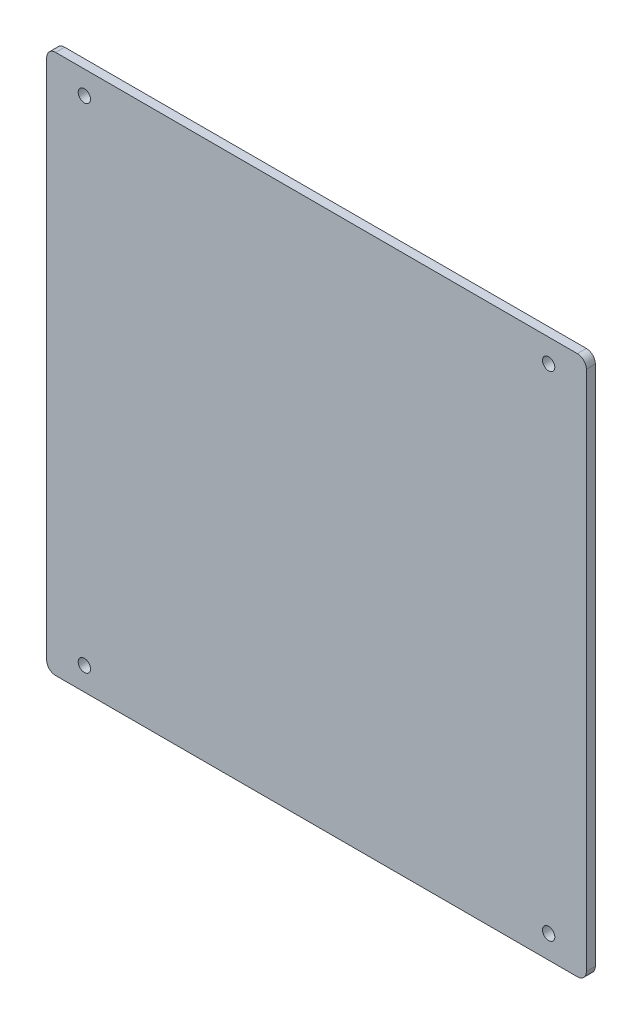
ISO-10303-21;
HEADER;
FILE_DESCRIPTION(('STEP AP214'),'2;1');
FILE_NAME('part.step','',(''),(''),'','','');
FILE_SCHEMA(('AUTOMOTIVE_DESIGN { 1 0 10303 214 1 1 1 1 }'));
ENDSEC;
DATA;
#1=APPLICATION_CONTEXT('core data for automotive mechanical design processes');
#2=APPLICATION_PROTOCOL_DEFINITION('international standard','automotive_design',2000,#1);
#3=PRODUCT_CONTEXT('',#1,'mechanical');
#4=PRODUCT('Part','Part','',(#3));
#5=PRODUCT_RELATED_PRODUCT_CATEGORY('part','',(#4));
#6=PRODUCT_DEFINITION_FORMATION('','',#4);
#7=PRODUCT_DEFINITION_CONTEXT('part definition',#1,'design');
#8=PRODUCT_DEFINITION('design','',#6,#7);
#9=PRODUCT_DEFINITION_SHAPE('','',#8);
#10=(LENGTH_UNIT() NAMED_UNIT(*) SI_UNIT(.MILLI.,.METRE.));
#11=(NAMED_UNIT(*) PLANE_ANGLE_UNIT() SI_UNIT($,.RADIAN.));
#12=(NAMED_UNIT(*) SI_UNIT($,.STERADIAN.) SOLID_ANGLE_UNIT());
#13=UNCERTAINTY_MEASURE_WITH_UNIT(LENGTH_MEASURE(1.E-05),#10,'distance_accuracy_value','');
#14=(GEOMETRIC_REPRESENTATION_CONTEXT(3) GLOBAL_UNCERTAINTY_ASSIGNED_CONTEXT((#13)) GLOBAL_UNIT_ASSIGNED_CONTEXT((#10,
#11,#12)) REPRESENTATION_CONTEXT('',''));
#15=CARTESIAN_POINT('',(0.,0.,0.));
#16=DIRECTION('',(0.,0.,1.));
#17=DIRECTION('',(1.,0.,0.));
#18=AXIS2_PLACEMENT_3D('',#15,#16,#17);
#19=CARTESIAN_POINT('',(90.,-90.,3.));
#20=DIRECTION('',(-1.,0.,0.));
#21=DIRECTION('',(0.,0.,1.));
#22=AXIS2_PLACEMENT_3D('',#19,#20,#21);
#23=PLANE('',#22);
#24=DIRECTION('',(0.,1.,0.));
#25=VECTOR('',#24,1.);
#26=CARTESIAN_POINT('',(90.,-90.,3.));
#27=LINE('',#26,#25);
#28=CARTESIAN_POINT('',(90.,-87.,3.));
#29=VERTEX_POINT('',#28);
#30=CARTESIAN_POINT('',(90.,86.9999999999999,3.));
#31=VERTEX_POINT('',#30);
#32=EDGE_CURVE('E121',#29,#31,#27,.T.);
#33=ORIENTED_EDGE('',*,*,#32,.F.);
#34=DIRECTION('',(0.,0.,-1.));
#35=VECTOR('',#34,1.);
#36=CARTESIAN_POINT('',(90.,-87.,3.));
#37=LINE('',#36,#35);
#38=CARTESIAN_POINT('',(90.,-87.,0.));
#39=VERTEX_POINT('',#38);
#40=EDGE_CURVE('E106',#29,#39,#37,.T.);
#41=ORIENTED_EDGE('',*,*,#40,.T.);
#42=DIRECTION('',(0.,1.,0.));
#43=VECTOR('',#42,1.);
#44=CARTESIAN_POINT('',(90.,-90.,0.));
#45=LINE('',#44,#43);
#46=CARTESIAN_POINT('',(90.,86.9999999999999,0.));
#47=VERTEX_POINT('',#46);
#48=EDGE_CURVE('E118',#39,#47,#45,.T.);
#49=ORIENTED_EDGE('',*,*,#48,.T.);
#50=DIRECTION('',(0.,0.,-1.));
#51=VECTOR('',#50,1.);
#52=CARTESIAN_POINT('',(90.,87.,3.));
#53=LINE('',#52,#51);
#54=EDGE_CURVE('E123',#47,#31,#53,.F.);
#55=ORIENTED_EDGE('',*,*,#54,.T.);
#56=EDGE_LOOP('',(#33,#41,#49,#55));
#57=FACE_BOUND('',#56,.T.);
#58=ADVANCED_FACE('F36',(#57),#23,.F.);
#59=CARTESIAN_POINT('',(-90.,90.,3.));
#60=DIRECTION('',(0.,-1.,0.));
#61=DIRECTION('',(0.,0.,-1.));
#62=AXIS2_PLACEMENT_3D('',#59,#60,#61);
#63=PLANE('',#62);
#64=DIRECTION('',(-1.,0.,0.));
#65=VECTOR('',#64,1.);
#66=CARTESIAN_POINT('',(-90.,90.,0.));
#67=LINE('',#66,#65);
#68=CARTESIAN_POINT('',(86.9999999999999,90.,0.));
#69=VERTEX_POINT('',#68);
#70=CARTESIAN_POINT('',(-87.,90.,0.));
#71=VERTEX_POINT('',#70);
#72=EDGE_CURVE('E127',#69,#71,#67,.T.);
#73=ORIENTED_EDGE('',*,*,#72,.T.);
#74=DIRECTION('',(0.,0.,-1.));
#75=VECTOR('',#74,1.);
#76=CARTESIAN_POINT('',(-87.,90.,3.));
#77=LINE('',#76,#75);
#78=CARTESIAN_POINT('',(-87.,90.,3.));
#79=VERTEX_POINT('',#78);
#80=EDGE_CURVE('E11',#71,#79,#77,.F.);
#81=ORIENTED_EDGE('',*,*,#80,.T.);
#82=DIRECTION('',(-1.,0.,0.));
#83=VECTOR('',#82,1.);
#84=CARTESIAN_POINT('',(-90.,90.,3.));
#85=LINE('',#84,#83);
#86=CARTESIAN_POINT('',(86.9999999999999,90.,3.));
#87=VERTEX_POINT('',#86);
#88=EDGE_CURVE('E167',#87,#79,#85,.T.);
#89=ORIENTED_EDGE('',*,*,#88,.F.);
#90=DIRECTION('',(0.,0.,-1.));
#91=VECTOR('',#90,1.);
#92=CARTESIAN_POINT('',(87.,90.,3.));
#93=LINE('',#92,#91);
#94=EDGE_CURVE('E44',#87,#69,#93,.T.);
#95=ORIENTED_EDGE('',*,*,#94,.T.);
#96=EDGE_LOOP('',(#73,#81,#89,#95));
#97=FACE_BOUND('',#96,.T.);
#98=ADVANCED_FACE('F165',(#97),#63,.F.);
#99=CARTESIAN_POINT('',(-90.,-90.,3.));
#100=DIRECTION('',(1.,0.,0.));
#101=DIRECTION('',(0.,0.,-1.));
#102=AXIS2_PLACEMENT_3D('',#99,#100,#101);
#103=PLANE('',#102);
#104=DIRECTION('',(0.,-1.,0.));
#105=VECTOR('',#104,1.);
#106=CARTESIAN_POINT('',(-90.,-90.,0.));
#107=LINE('',#106,#105);
#108=CARTESIAN_POINT('',(-90.,86.9999999999999,0.));
#109=VERTEX_POINT('',#108);
#110=CARTESIAN_POINT('',(-90.,-87.,0.));
#111=VERTEX_POINT('',#110);
#112=EDGE_CURVE('E131',#109,#111,#107,.T.);
#113=ORIENTED_EDGE('',*,*,#112,.T.);
#114=DIRECTION('',(0.,0.,-1.));
#115=VECTOR('',#114,1.);
#116=CARTESIAN_POINT('',(-90.,-87.,3.));
#117=LINE('',#116,#115);
#118=CARTESIAN_POINT('',(-90.,-87.,3.));
#119=VERTEX_POINT('',#118);
#120=EDGE_CURVE('E51',#111,#119,#117,.F.);
#121=ORIENTED_EDGE('',*,*,#120,.T.);
#122=DIRECTION('',(0.,-1.,0.));
#123=VECTOR('',#122,1.);
#124=CARTESIAN_POINT('',(-90.,-90.,3.));
#125=LINE('',#124,#123);
#126=CARTESIAN_POINT('',(-90.,86.9999999999999,3.));
#127=VERTEX_POINT('',#126);
#128=EDGE_CURVE('E175',#127,#119,#125,.T.);
#129=ORIENTED_EDGE('',*,*,#128,.F.);
#130=DIRECTION('',(0.,0.,-1.));
#131=VECTOR('',#130,1.);
#132=CARTESIAN_POINT('',(-90.,87.,3.));
#133=LINE('',#132,#131);
#134=EDGE_CURVE('E158',#127,#109,#133,.T.);
#135=ORIENTED_EDGE('',*,*,#134,.T.);
#136=EDGE_LOOP('',(#113,#121,#129,#135));
#137=FACE_BOUND('',#136,.T.);
#138=ADVANCED_FACE('F174',(#137),#103,.F.);
#139=CARTESIAN_POINT('',(-90.,-90.,3.));
#140=DIRECTION('',(0.,1.,0.));
#141=DIRECTION('',(0.,0.,1.));
#142=AXIS2_PLACEMENT_3D('',#139,#140,#141);
#143=PLANE('',#142);
#144=DIRECTION('',(1.,0.,0.));
#145=VECTOR('',#144,1.);
#146=CARTESIAN_POINT('',(-90.,-90.,0.));
#147=LINE('',#146,#145);
#148=CARTESIAN_POINT('',(-87.,-90.,0.));
#149=VERTEX_POINT('',#148);
#150=CARTESIAN_POINT('',(86.9999999999999,-90.,0.));
#151=VERTEX_POINT('',#150);
#152=EDGE_CURVE('E141',#149,#151,#147,.T.);
#153=ORIENTED_EDGE('',*,*,#152,.T.);
#154=DIRECTION('',(0.,0.,-1.));
#155=VECTOR('',#154,1.);
#156=CARTESIAN_POINT('',(87.,-90.,3.));
#157=LINE('',#156,#155);
#158=CARTESIAN_POINT('',(86.9999999999999,-90.,3.));
#159=VERTEX_POINT('',#158);
#160=EDGE_CURVE('E107',#151,#159,#157,.F.);
#161=ORIENTED_EDGE('',*,*,#160,.T.);
#162=DIRECTION('',(1.,0.,0.));
#163=VECTOR('',#162,1.);
#164=CARTESIAN_POINT('',(-90.,-90.,3.));
#165=LINE('',#164,#163);
#166=CARTESIAN_POINT('',(-87.,-90.,3.));
#167=VERTEX_POINT('',#166);
#168=EDGE_CURVE('E137',#167,#159,#165,.T.);
#169=ORIENTED_EDGE('',*,*,#168,.F.);
#170=DIRECTION('',(0.,0.,-1.));
#171=VECTOR('',#170,1.);
#172=CARTESIAN_POINT('',(-87.,-90.,3.));
#173=LINE('',#172,#171);
#174=EDGE_CURVE('E112',#167,#149,#173,.T.);
#175=ORIENTED_EDGE('',*,*,#174,.T.);
#176=EDGE_LOOP('',(#153,#161,#169,#175));
#177=FACE_BOUND('',#176,.T.);
#178=ADVANCED_FACE('F215',(#177),#143,.F.);
#179=CARTESIAN_POINT('',(0.,0.,3.));
#180=DIRECTION('',(0.,0.,-1.));
#181=DIRECTION('',(-1.,0.,0.));
#182=AXIS2_PLACEMENT_3D('',#179,#180,#181);
#183=PLANE('',#182);
#184=CARTESIAN_POINT('',(-77.42949016,-82.268833295,3.));
#185=DIRECTION('',(0.,0.,1.));
#186=DIRECTION('',(-1.,0.,0.));
#187=AXIS2_PLACEMENT_3D('',#184,#185,#186);
#188=CIRCLE('',#187,2.04999999999999);
#189=CARTESIAN_POINT('',(-75.37949016,-82.268833295,3.));
#190=VERTEX_POINT('',#189);
#191=EDGE_CURVE('E184',#190,#190,#188,.T.);
#192=ORIENTED_EDGE('',*,*,#191,.F.);
#193=EDGE_LOOP('',(#192));
#194=FACE_BOUND('',#193,.T.);
#195=CARTESIAN_POINT('',(77.42949016,-82.268833295,3.));
#196=DIRECTION('',(0.,0.,1.));
#197=DIRECTION('',(1.,0.,0.));
#198=AXIS2_PLACEMENT_3D('',#195,#196,#197);
#199=CIRCLE('',#198,2.04999999999999);
#200=CARTESIAN_POINT('',(79.47949016,-82.268833295,3.));
#201=VERTEX_POINT('',#200);
#202=EDGE_CURVE('E190',#201,#201,#199,.T.);
#203=ORIENTED_EDGE('',*,*,#202,.F.);
#204=EDGE_LOOP('',(#203));
#205=FACE_BOUND('',#204,.T.);
#206=CARTESIAN_POINT('',(77.42949016,82.268833295,3.));
#207=DIRECTION('',(0.,0.,1.));
#208=DIRECTION('',(-1.,0.,0.));
#209=AXIS2_PLACEMENT_3D('',#206,#207,#208);
#210=CIRCLE('',#209,2.04999999999999);
#211=CARTESIAN_POINT('',(79.47949016,82.268833295,3.));
#212=VERTEX_POINT('',#211);
#213=EDGE_CURVE('E196',#212,#212,#210,.T.);
#214=ORIENTED_EDGE('',*,*,#213,.F.);
#215=EDGE_LOOP('',(#214));
#216=FACE_BOUND('',#215,.T.);
#217=CARTESIAN_POINT('',(-77.42949016,82.268833295,3.));
#218=DIRECTION('',(0.,0.,1.));
#219=DIRECTION('',(1.,0.,0.));
#220=AXIS2_PLACEMENT_3D('',#217,#218,#219);
#221=CIRCLE('',#220,2.04999999999999);
#222=CARTESIAN_POINT('',(-75.37949016,82.268833295,3.));
#223=VERTEX_POINT('',#222);
#224=EDGE_CURVE('E128',#223,#223,#221,.T.);
#225=ORIENTED_EDGE('',*,*,#224,.F.);
#226=EDGE_LOOP('',(#225));
#227=FACE_BOUND('',#226,.T.);
#228=ORIENTED_EDGE('',*,*,#168,.T.);
#229=CARTESIAN_POINT('',(87.,-87.,3.));
#230=DIRECTION('',(0.,0.,-1.));
#231=DIRECTION('',(-1.,0.,0.));
#232=AXIS2_PLACEMENT_3D('',#229,#230,#231);
#233=CIRCLE('',#232,3.);
#234=EDGE_CURVE('E156',#159,#29,#233,.F.);
#235=ORIENTED_EDGE('',*,*,#234,.T.);
#236=ORIENTED_EDGE('',*,*,#32,.T.);
#237=CARTESIAN_POINT('',(87.,87.,3.));
#238=DIRECTION('',(0.,0.,-1.));
#239=DIRECTION('',(-1.,0.,0.));
#240=AXIS2_PLACEMENT_3D('',#237,#238,#239);
#241=CIRCLE('',#240,3.);
#242=EDGE_CURVE('E151',#31,#87,#241,.F.);
#243=ORIENTED_EDGE('',*,*,#242,.T.);
#244=ORIENTED_EDGE('',*,*,#88,.T.);
#245=CARTESIAN_POINT('',(-87.,87.,3.));
#246=DIRECTION('',(0.,0.,-1.));
#247=DIRECTION('',(-1.,0.,0.));
#248=AXIS2_PLACEMENT_3D('',#245,#246,#247);
#249=CIRCLE('',#248,3.);
#250=EDGE_CURVE('E58',#79,#127,#249,.F.);
#251=ORIENTED_EDGE('',*,*,#250,.T.);
#252=ORIENTED_EDGE('',*,*,#128,.T.);
#253=CARTESIAN_POINT('',(-87.,-87.,3.));
#254=DIRECTION('',(0.,0.,-1.));
#255=DIRECTION('',(-1.,0.,0.));
#256=AXIS2_PLACEMENT_3D('',#253,#254,#255);
#257=CIRCLE('',#256,3.);
#258=EDGE_CURVE('E154',#119,#167,#257,.F.);
#259=ORIENTED_EDGE('',*,*,#258,.T.);
#260=EDGE_LOOP('',(#228,#235,#236,#243,#244,#251,#252,#259));
#261=FACE_BOUND('',#260,.T.);
#262=ADVANCED_FACE('F212',(#194,#205,#216,#227,#261),#183,.F.);
#263=CARTESIAN_POINT('',(0.,0.,0.));
#264=DIRECTION('',(0.,0.,-1.));
#265=DIRECTION('',(-1.,0.,0.));
#266=AXIS2_PLACEMENT_3D('',#263,#264,#265);
#267=PLANE('',#266);
#268=CARTESIAN_POINT('',(-77.42949016,-82.268833295,0.));
#269=DIRECTION('',(0.,0.,-1.));
#270=DIRECTION('',(-1.,0.,0.));
#271=AXIS2_PLACEMENT_3D('',#268,#269,#270);
#272=CIRCLE('',#271,2.04999999999999);
#273=CARTESIAN_POINT('',(-75.37949016,-82.268833295,0.));
#274=VERTEX_POINT('',#273);
#275=EDGE_CURVE('E187',#274,#274,#272,.F.);
#276=ORIENTED_EDGE('',*,*,#275,.T.);
#277=EDGE_LOOP('',(#276));
#278=FACE_BOUND('',#277,.T.);
#279=CARTESIAN_POINT('',(77.42949016,-82.268833295,0.));
#280=DIRECTION('',(0.,0.,-1.));
#281=DIRECTION('',(-1.,0.,0.));
#282=AXIS2_PLACEMENT_3D('',#279,#280,#281);
#283=CIRCLE('',#282,2.04999999999999);
#284=CARTESIAN_POINT('',(79.47949016,-82.268833295,0.));
#285=VERTEX_POINT('',#284);
#286=EDGE_CURVE('E193',#285,#285,#283,.F.);
#287=ORIENTED_EDGE('',*,*,#286,.T.);
#288=EDGE_LOOP('',(#287));
#289=FACE_BOUND('',#288,.T.);
#290=CARTESIAN_POINT('',(77.42949016,82.268833295,0.));
#291=DIRECTION('',(0.,0.,-1.));
#292=DIRECTION('',(-1.,0.,0.));
#293=AXIS2_PLACEMENT_3D('',#290,#291,#292);
#294=CIRCLE('',#293,2.04999999999999);
#295=CARTESIAN_POINT('',(79.47949016,82.268833295,0.));
#296=VERTEX_POINT('',#295);
#297=EDGE_CURVE('E182',#296,#296,#294,.F.);
#298=ORIENTED_EDGE('',*,*,#297,.T.);
#299=EDGE_LOOP('',(#298));
#300=FACE_BOUND('',#299,.T.);
#301=CARTESIAN_POINT('',(-77.42949016,82.268833295,0.));
#302=DIRECTION('',(0.,0.,-1.));
#303=DIRECTION('',(-1.,0.,0.));
#304=AXIS2_PLACEMENT_3D('',#301,#302,#303);
#305=CIRCLE('',#304,2.04999999999999);
#306=CARTESIAN_POINT('',(-75.37949016,82.268833295,0.));
#307=VERTEX_POINT('',#306);
#308=EDGE_CURVE('E134',#307,#307,#305,.F.);
#309=ORIENTED_EDGE('',*,*,#308,.T.);
#310=EDGE_LOOP('',(#309));
#311=FACE_BOUND('',#310,.T.);
#312=ORIENTED_EDGE('',*,*,#48,.F.);
#313=CARTESIAN_POINT('',(87.,-87.,0.));
#314=DIRECTION('',(0.,0.,-1.));
#315=DIRECTION('',(-1.,0.,0.));
#316=AXIS2_PLACEMENT_3D('',#313,#314,#315);
#317=CIRCLE('',#316,3.);
#318=EDGE_CURVE('E102',#39,#151,#317,.T.);
#319=ORIENTED_EDGE('',*,*,#318,.T.);
#320=ORIENTED_EDGE('',*,*,#152,.F.);
#321=CARTESIAN_POINT('',(-87.,-87.,0.));
#322=DIRECTION('',(0.,0.,-1.));
#323=DIRECTION('',(-1.,0.,0.));
#324=AXIS2_PLACEMENT_3D('',#321,#322,#323);
#325=CIRCLE('',#324,3.);
#326=EDGE_CURVE('E113',#149,#111,#325,.T.);
#327=ORIENTED_EDGE('',*,*,#326,.T.);
#328=ORIENTED_EDGE('',*,*,#112,.F.);
#329=CARTESIAN_POINT('',(-87.,87.,0.));
#330=DIRECTION('',(0.,0.,-1.));
#331=DIRECTION('',(-1.,0.,0.));
#332=AXIS2_PLACEMENT_3D('',#329,#330,#331);
#333=CIRCLE('',#332,3.);
#334=EDGE_CURVE('E145',#109,#71,#333,.T.);
#335=ORIENTED_EDGE('',*,*,#334,.T.);
#336=ORIENTED_EDGE('',*,*,#72,.F.);
#337=CARTESIAN_POINT('',(87.,87.,0.));
#338=DIRECTION('',(0.,0.,-1.));
#339=DIRECTION('',(-1.,0.,0.));
#340=AXIS2_PLACEMENT_3D('',#337,#338,#339);
#341=CIRCLE('',#340,3.);
#342=EDGE_CURVE('E122',#69,#47,#341,.T.);
#343=ORIENTED_EDGE('',*,*,#342,.T.);
#344=EDGE_LOOP('',(#312,#319,#320,#327,#328,#335,#336,#343));
#345=FACE_BOUND('',#344,.T.);
#346=ADVANCED_FACE('F125',(#278,#289,#300,#311,#345),#267,.T.);
#347=CARTESIAN_POINT('',(87.,-87.,3.));
#348=DIRECTION('',(0.,0.,-1.));
#349=DIRECTION('',(-1.,0.,0.));
#350=AXIS2_PLACEMENT_3D('',#347,#348,#349);
#351=CYLINDRICAL_SURFACE('',#350,3.);
#352=ORIENTED_EDGE('',*,*,#234,.F.);
#353=ORIENTED_EDGE('',*,*,#160,.F.);
#354=ORIENTED_EDGE('',*,*,#318,.F.);
#355=ORIENTED_EDGE('',*,*,#40,.F.);
#356=EDGE_LOOP('',(#352,#353,#354,#355));
#357=FACE_BOUND('',#356,.T.);
#358=ADVANCED_FACE('F105',(#357),#351,.T.);
#359=CARTESIAN_POINT('',(-87.,-87.,3.));
#360=DIRECTION('',(0.,0.,-1.));
#361=DIRECTION('',(-1.,0.,0.));
#362=AXIS2_PLACEMENT_3D('',#359,#360,#361);
#363=CYLINDRICAL_SURFACE('',#362,3.);
#364=ORIENTED_EDGE('',*,*,#258,.F.);
#365=ORIENTED_EDGE('',*,*,#120,.F.);
#366=ORIENTED_EDGE('',*,*,#326,.F.);
#367=ORIENTED_EDGE('',*,*,#174,.F.);
#368=EDGE_LOOP('',(#364,#365,#366,#367));
#369=FACE_BOUND('',#368,.T.);
#370=ADVANCED_FACE('F223',(#369),#363,.T.);
#371=CARTESIAN_POINT('',(-87.,87.,3.));
#372=DIRECTION('',(0.,0.,-1.));
#373=DIRECTION('',(-1.,0.,0.));
#374=AXIS2_PLACEMENT_3D('',#371,#372,#373);
#375=CYLINDRICAL_SURFACE('',#374,3.);
#376=ORIENTED_EDGE('',*,*,#250,.F.);
#377=ORIENTED_EDGE('',*,*,#80,.F.);
#378=ORIENTED_EDGE('',*,*,#334,.F.);
#379=ORIENTED_EDGE('',*,*,#134,.F.);
#380=EDGE_LOOP('',(#376,#377,#378,#379));
#381=FACE_BOUND('',#380,.T.);
#382=ADVANCED_FACE('F173',(#381),#375,.T.);
#383=CARTESIAN_POINT('',(87.,87.,3.));
#384=DIRECTION('',(0.,0.,-1.));
#385=DIRECTION('',(-1.,0.,0.));
#386=AXIS2_PLACEMENT_3D('',#383,#384,#385);
#387=CYLINDRICAL_SURFACE('',#386,3.);
#388=ORIENTED_EDGE('',*,*,#242,.F.);
#389=ORIENTED_EDGE('',*,*,#54,.F.);
#390=ORIENTED_EDGE('',*,*,#342,.F.);
#391=ORIENTED_EDGE('',*,*,#94,.F.);
#392=EDGE_LOOP('',(#388,#389,#390,#391));
#393=FACE_BOUND('',#392,.T.);
#394=ADVANCED_FACE('F38',(#393),#387,.T.);
#395=CARTESIAN_POINT('',(-77.42949016,82.268833295,-0.00100000000000013));
#396=DIRECTION('',(0.,0.,1.));
#397=DIRECTION('',(1.,0.,0.));
#398=AXIS2_PLACEMENT_3D('',#395,#396,#397);
#399=CYLINDRICAL_SURFACE('',#398,2.04999999999999);
#400=CARTESIAN_POINT('',(-75.37949016,82.268833295,0.));
#401=CARTESIAN_POINT('',(-75.37949016,82.268833295,0.03125));
#402=CARTESIAN_POINT('',(-75.37949016,82.268833295,0.0625));
#403=CARTESIAN_POINT('',(-75.37949016,82.268833295,0.125));
#404=CARTESIAN_POINT('',(-75.37949016,82.268833295,0.15625));
#405=CARTESIAN_POINT('',(-75.37949016,82.268833295,0.21875));
#406=CARTESIAN_POINT('',(-75.37949016,82.268833295,0.25));
#407=CARTESIAN_POINT('',(-75.37949016,82.268833295,0.3125));
#408=CARTESIAN_POINT('',(-75.37949016,82.268833295,0.34375));
#409=CARTESIAN_POINT('',(-75.37949016,82.268833295,0.40625));
#410=CARTESIAN_POINT('',(-75.37949016,82.268833295,0.4375));
#411=CARTESIAN_POINT('',(-75.37949016,82.268833295,0.5));
#412=CARTESIAN_POINT('',(-75.37949016,82.268833295,0.53125));
#413=CARTESIAN_POINT('',(-75.37949016,82.268833295,0.59375));
#414=CARTESIAN_POINT('',(-75.37949016,82.268833295,0.625));
#415=CARTESIAN_POINT('',(-75.37949016,82.268833295,0.6875));
#416=CARTESIAN_POINT('',(-75.37949016,82.268833295,0.71875));
#417=CARTESIAN_POINT('',(-75.37949016,82.268833295,0.78125));
#418=CARTESIAN_POINT('',(-75.37949016,82.268833295,0.8125));
#419=CARTESIAN_POINT('',(-75.37949016,82.268833295,0.875));
#420=CARTESIAN_POINT('',(-75.37949016,82.268833295,0.90625));
#421=CARTESIAN_POINT('',(-75.37949016,82.268833295,0.96875));
#422=CARTESIAN_POINT('',(-75.37949016,82.268833295,1.));
#423=CARTESIAN_POINT('',(-75.37949016,82.268833295,1.0625));
#424=CARTESIAN_POINT('',(-75.37949016,82.268833295,1.09375));
#425=CARTESIAN_POINT('',(-75.37949016,82.268833295,1.15625));
#426=CARTESIAN_POINT('',(-75.37949016,82.268833295,1.1875));
#427=CARTESIAN_POINT('',(-75.37949016,82.268833295,1.25));
#428=CARTESIAN_POINT('',(-75.37949016,82.268833295,1.28125));
#429=CARTESIAN_POINT('',(-75.37949016,82.268833295,1.34375));
#430=CARTESIAN_POINT('',(-75.37949016,82.268833295,1.375));
#431=CARTESIAN_POINT('',(-75.37949016,82.268833295,1.4375));
#432=CARTESIAN_POINT('',(-75.37949016,82.268833295,1.46875));
#433=CARTESIAN_POINT('',(-75.37949016,82.268833295,1.53125));
#434=CARTESIAN_POINT('',(-75.37949016,82.268833295,1.5625));
#435=CARTESIAN_POINT('',(-75.37949016,82.268833295,1.625));
#436=CARTESIAN_POINT('',(-75.37949016,82.268833295,1.65625));
#437=CARTESIAN_POINT('',(-75.37949016,82.268833295,1.71875));
#438=CARTESIAN_POINT('',(-75.37949016,82.268833295,1.75));
#439=CARTESIAN_POINT('',(-75.37949016,82.268833295,1.8125));
#440=CARTESIAN_POINT('',(-75.37949016,82.268833295,1.84375));
#441=CARTESIAN_POINT('',(-75.37949016,82.268833295,1.90625));
#442=CARTESIAN_POINT('',(-75.37949016,82.268833295,1.9375));
#443=CARTESIAN_POINT('',(-75.37949016,82.268833295,2.));
#444=CARTESIAN_POINT('',(-75.37949016,82.268833295,2.03125));
#445=CARTESIAN_POINT('',(-75.37949016,82.268833295,2.09375));
#446=CARTESIAN_POINT('',(-75.37949016,82.268833295,2.125));
#447=CARTESIAN_POINT('',(-75.37949016,82.268833295,2.1875));
#448=CARTESIAN_POINT('',(-75.37949016,82.268833295,2.21875));
#449=CARTESIAN_POINT('',(-75.37949016,82.268833295,2.28125));
#450=CARTESIAN_POINT('',(-75.37949016,82.268833295,2.3125));
#451=CARTESIAN_POINT('',(-75.37949016,82.268833295,2.375));
#452=CARTESIAN_POINT('',(-75.37949016,82.268833295,2.40625));
#453=CARTESIAN_POINT('',(-75.37949016,82.268833295,2.46875));
#454=CARTESIAN_POINT('',(-75.37949016,82.268833295,2.5));
#455=CARTESIAN_POINT('',(-75.37949016,82.268833295,2.5625));
#456=CARTESIAN_POINT('',(-75.37949016,82.268833295,2.59375));
#457=CARTESIAN_POINT('',(-75.37949016,82.268833295,2.65625));
#458=CARTESIAN_POINT('',(-75.37949016,82.268833295,2.6875));
#459=CARTESIAN_POINT('',(-75.37949016,82.268833295,2.75));
#460=CARTESIAN_POINT('',(-75.37949016,82.268833295,2.78125));
#461=CARTESIAN_POINT('',(-75.37949016,82.268833295,2.84375));
#462=CARTESIAN_POINT('',(-75.37949016,82.268833295,2.875));
#463=CARTESIAN_POINT('',(-75.37949016,82.268833295,2.9375));
#464=CARTESIAN_POINT('',(-75.37949016,82.268833295,2.96875));
#465=CARTESIAN_POINT('',(-75.37949016,82.268833295,3.));
#466=B_SPLINE_CURVE_WITH_KNOTS('',3,(#400,#401,#402,#403,#404,#405,#406,#407,#408,#409,#410,
#411,#412,#413,#414,#415,#416,#417,#418,#419,#420,#421,#422,#423,#424,#425,#426,#427,#428,#429,
#430,#431,#432,#433,#434,#435,#436,#437,#438,#439,#440,#441,#442,#443,#444,#445,#446,#447,#448,
#449,#450,#451,#452,#453,#454,#455,#456,#457,#458,#459,#460,#461,#462,#463,#464,#465),
.UNSPECIFIED.,.F.,.F.,(4,2,2,2,2,2,2,2,2,2,2,2,2,2,2,2,2,2,2,2,2,2,2,2,2,2,2,2,2,2,2,2,4),(0.,
0.09375,0.1875,0.28125,0.375,0.46875,0.5625,0.65625,0.75,0.84375,0.9375,1.03125,1.125,1.21875,
1.3125,1.40625,1.5,1.59375,1.6875,1.78125,1.875,1.96875,2.0625,2.15625,2.25,2.34375,2.4375,
2.53125,2.625,2.71875,2.8125,2.90625,3.),.UNSPECIFIED.);
#467=EDGE_CURVE('BSEAM208',#307,#223,#466,.T.);
#468=ORIENTED_EDGE('',*,*,#308,.F.);
#469=ORIENTED_EDGE('',*,*,#224,.T.);
#470=ORIENTED_EDGE('',*,*,#467,.T.);
#471=ORIENTED_EDGE('',*,*,#467,.F.);
#472=EDGE_LOOP('',(#468,#470,#469,#471));
#473=FACE_BOUND('',#472,.T.);
#474=ADVANCED_FACE('F208',(#473),#399,.F.);
#475=CARTESIAN_POINT('',(77.42949016,82.268833295,-0.00100000000000013));
#476=DIRECTION('',(0.,0.,1.));
#477=DIRECTION('',(1.,0.,0.));
#478=AXIS2_PLACEMENT_3D('',#475,#476,#477);
#479=CYLINDRICAL_SURFACE('',#478,2.04999999999999);
#480=CARTESIAN_POINT('',(79.47949016,82.268833295,0.));
#481=CARTESIAN_POINT('',(79.47949016,82.268833295,0.03125));
#482=CARTESIAN_POINT('',(79.47949016,82.268833295,0.0625));
#483=CARTESIAN_POINT('',(79.47949016,82.268833295,0.125));
#484=CARTESIAN_POINT('',(79.47949016,82.268833295,0.15625));
#485=CARTESIAN_POINT('',(79.47949016,82.268833295,0.21875));
#486=CARTESIAN_POINT('',(79.47949016,82.268833295,0.25));
#487=CARTESIAN_POINT('',(79.47949016,82.268833295,0.3125));
#488=CARTESIAN_POINT('',(79.47949016,82.268833295,0.34375));
#489=CARTESIAN_POINT('',(79.47949016,82.268833295,0.40625));
#490=CARTESIAN_POINT('',(79.47949016,82.268833295,0.4375));
#491=CARTESIAN_POINT('',(79.47949016,82.268833295,0.5));
#492=CARTESIAN_POINT('',(79.47949016,82.268833295,0.53125));
#493=CARTESIAN_POINT('',(79.47949016,82.268833295,0.59375));
#494=CARTESIAN_POINT('',(79.47949016,82.268833295,0.625));
#495=CARTESIAN_POINT('',(79.47949016,82.268833295,0.6875));
#496=CARTESIAN_POINT('',(79.47949016,82.268833295,0.71875));
#497=CARTESIAN_POINT('',(79.47949016,82.268833295,0.78125));
#498=CARTESIAN_POINT('',(79.47949016,82.268833295,0.8125));
#499=CARTESIAN_POINT('',(79.47949016,82.268833295,0.875));
#500=CARTESIAN_POINT('',(79.47949016,82.268833295,0.90625));
#501=CARTESIAN_POINT('',(79.47949016,82.268833295,0.96875));
#502=CARTESIAN_POINT('',(79.47949016,82.268833295,1.));
#503=CARTESIAN_POINT('',(79.47949016,82.268833295,1.0625));
#504=CARTESIAN_POINT('',(79.47949016,82.268833295,1.09375));
#505=CARTESIAN_POINT('',(79.47949016,82.268833295,1.15625));
#506=CARTESIAN_POINT('',(79.47949016,82.268833295,1.1875));
#507=CARTESIAN_POINT('',(79.47949016,82.268833295,1.25));
#508=CARTESIAN_POINT('',(79.47949016,82.268833295,1.28125));
#509=CARTESIAN_POINT('',(79.47949016,82.268833295,1.34375));
#510=CARTESIAN_POINT('',(79.47949016,82.268833295,1.375));
#511=CARTESIAN_POINT('',(79.47949016,82.268833295,1.4375));
#512=CARTESIAN_POINT('',(79.47949016,82.268833295,1.46875));
#513=CARTESIAN_POINT('',(79.47949016,82.268833295,1.53125));
#514=CARTESIAN_POINT('',(79.47949016,82.268833295,1.5625));
#515=CARTESIAN_POINT('',(79.47949016,82.268833295,1.625));
#516=CARTESIAN_POINT('',(79.47949016,82.268833295,1.65625));
#517=CARTESIAN_POINT('',(79.47949016,82.268833295,1.71875));
#518=CARTESIAN_POINT('',(79.47949016,82.268833295,1.75));
#519=CARTESIAN_POINT('',(79.47949016,82.268833295,1.8125));
#520=CARTESIAN_POINT('',(79.47949016,82.268833295,1.84375));
#521=CARTESIAN_POINT('',(79.47949016,82.268833295,1.90625));
#522=CARTESIAN_POINT('',(79.47949016,82.268833295,1.9375));
#523=CARTESIAN_POINT('',(79.47949016,82.268833295,2.));
#524=CARTESIAN_POINT('',(79.47949016,82.268833295,2.03125));
#525=CARTESIAN_POINT('',(79.47949016,82.268833295,2.09375));
#526=CARTESIAN_POINT('',(79.47949016,82.268833295,2.125));
#527=CARTESIAN_POINT('',(79.47949016,82.268833295,2.1875));
#528=CARTESIAN_POINT('',(79.47949016,82.268833295,2.21875));
#529=CARTESIAN_POINT('',(79.47949016,82.268833295,2.28125));
#530=CARTESIAN_POINT('',(79.47949016,82.268833295,2.3125));
#531=CARTESIAN_POINT('',(79.47949016,82.268833295,2.375));
#532=CARTESIAN_POINT('',(79.47949016,82.268833295,2.40625));
#533=CARTESIAN_POINT('',(79.47949016,82.268833295,2.46875));
#534=CARTESIAN_POINT('',(79.47949016,82.268833295,2.5));
#535=CARTESIAN_POINT('',(79.47949016,82.268833295,2.5625));
#536=CARTESIAN_POINT('',(79.47949016,82.268833295,2.59375));
#537=CARTESIAN_POINT('',(79.47949016,82.268833295,2.65625));
#538=CARTESIAN_POINT('',(79.47949016,82.268833295,2.6875));
#539=CARTESIAN_POINT('',(79.47949016,82.268833295,2.75));
#540=CARTESIAN_POINT('',(79.47949016,82.268833295,2.78125));
#541=CARTESIAN_POINT('',(79.47949016,82.268833295,2.84375));
#542=CARTESIAN_POINT('',(79.47949016,82.268833295,2.875));
#543=CARTESIAN_POINT('',(79.47949016,82.268833295,2.9375));
#544=CARTESIAN_POINT('',(79.47949016,82.268833295,2.96875));
#545=CARTESIAN_POINT('',(79.47949016,82.268833295,3.));
#546=B_SPLINE_CURVE_WITH_KNOTS('',3,(#480,#481,#482,#483,#484,#485,#486,#487,#488,#489,#490,
#491,#492,#493,#494,#495,#496,#497,#498,#499,#500,#501,#502,#503,#504,#505,#506,#507,#508,#509,
#510,#511,#512,#513,#514,#515,#516,#517,#518,#519,#520,#521,#522,#523,#524,#525,#526,#527,#528,
#529,#530,#531,#532,#533,#534,#535,#536,#537,#538,#539,#540,#541,#542,#543,#544,#545),
.UNSPECIFIED.,.F.,.F.,(4,2,2,2,2,2,2,2,2,2,2,2,2,2,2,2,2,2,2,2,2,2,2,2,2,2,2,2,2,2,2,2,4),(0.,
0.09375,0.1875,0.28125,0.375,0.46875,0.5625,0.65625,0.75,0.84375,0.9375,1.03125,1.125,1.21875,
1.3125,1.40625,1.5,1.59375,1.6875,1.78125,1.875,1.96875,2.0625,2.15625,2.25,2.34375,2.4375,
2.53125,2.625,2.71875,2.8125,2.90625,3.),.UNSPECIFIED.);
#547=EDGE_CURVE('BSEAM204',#296,#212,#546,.T.);
#548=ORIENTED_EDGE('',*,*,#297,.F.);
#549=ORIENTED_EDGE('',*,*,#213,.T.);
#550=ORIENTED_EDGE('',*,*,#547,.T.);
#551=ORIENTED_EDGE('',*,*,#547,.F.);
#552=EDGE_LOOP('',(#548,#550,#549,#551));
#553=FACE_BOUND('',#552,.T.);
#554=ADVANCED_FACE('F204',(#553),#479,.F.);
#555=CARTESIAN_POINT('',(77.42949016,-82.268833295,-0.00100000000000013));
#556=DIRECTION('',(0.,0.,1.));
#557=DIRECTION('',(1.,0.,0.));
#558=AXIS2_PLACEMENT_3D('',#555,#556,#557);
#559=CYLINDRICAL_SURFACE('',#558,2.04999999999999);
#560=CARTESIAN_POINT('',(79.47949016,-82.268833295,0.));
#561=CARTESIAN_POINT('',(79.47949016,-82.268833295,0.03125));
#562=CARTESIAN_POINT('',(79.47949016,-82.268833295,0.0625));
#563=CARTESIAN_POINT('',(79.47949016,-82.268833295,0.125));
#564=CARTESIAN_POINT('',(79.47949016,-82.268833295,0.15625));
#565=CARTESIAN_POINT('',(79.47949016,-82.268833295,0.21875));
#566=CARTESIAN_POINT('',(79.47949016,-82.268833295,0.25));
#567=CARTESIAN_POINT('',(79.47949016,-82.268833295,0.3125));
#568=CARTESIAN_POINT('',(79.47949016,-82.268833295,0.34375));
#569=CARTESIAN_POINT('',(79.47949016,-82.268833295,0.40625));
#570=CARTESIAN_POINT('',(79.47949016,-82.268833295,0.4375));
#571=CARTESIAN_POINT('',(79.47949016,-82.268833295,0.5));
#572=CARTESIAN_POINT('',(79.47949016,-82.268833295,0.53125));
#573=CARTESIAN_POINT('',(79.47949016,-82.268833295,0.59375));
#574=CARTESIAN_POINT('',(79.47949016,-82.268833295,0.625));
#575=CARTESIAN_POINT('',(79.47949016,-82.268833295,0.6875));
#576=CARTESIAN_POINT('',(79.47949016,-82.268833295,0.71875));
#577=CARTESIAN_POINT('',(79.47949016,-82.268833295,0.78125));
#578=CARTESIAN_POINT('',(79.47949016,-82.268833295,0.8125));
#579=CARTESIAN_POINT('',(79.47949016,-82.268833295,0.875));
#580=CARTESIAN_POINT('',(79.47949016,-82.268833295,0.90625));
#581=CARTESIAN_POINT('',(79.47949016,-82.268833295,0.96875));
#582=CARTESIAN_POINT('',(79.47949016,-82.268833295,1.));
#583=CARTESIAN_POINT('',(79.47949016,-82.268833295,1.0625));
#584=CARTESIAN_POINT('',(79.47949016,-82.268833295,1.09375));
#585=CARTESIAN_POINT('',(79.47949016,-82.268833295,1.15625));
#586=CARTESIAN_POINT('',(79.47949016,-82.268833295,1.1875));
#587=CARTESIAN_POINT('',(79.47949016,-82.268833295,1.25));
#588=CARTESIAN_POINT('',(79.47949016,-82.268833295,1.28125));
#589=CARTESIAN_POINT('',(79.47949016,-82.268833295,1.34375));
#590=CARTESIAN_POINT('',(79.47949016,-82.268833295,1.375));
#591=CARTESIAN_POINT('',(79.47949016,-82.268833295,1.4375));
#592=CARTESIAN_POINT('',(79.47949016,-82.268833295,1.46875));
#593=CARTESIAN_POINT('',(79.47949016,-82.268833295,1.53125));
#594=CARTESIAN_POINT('',(79.47949016,-82.268833295,1.5625));
#595=CARTESIAN_POINT('',(79.47949016,-82.268833295,1.625));
#596=CARTESIAN_POINT('',(79.47949016,-82.268833295,1.65625));
#597=CARTESIAN_POINT('',(79.47949016,-82.268833295,1.71875));
#598=CARTESIAN_POINT('',(79.47949016,-82.268833295,1.75));
#599=CARTESIAN_POINT('',(79.47949016,-82.268833295,1.8125));
#600=CARTESIAN_POINT('',(79.47949016,-82.268833295,1.84375));
#601=CARTESIAN_POINT('',(79.47949016,-82.268833295,1.90625));
#602=CARTESIAN_POINT('',(79.47949016,-82.268833295,1.9375));
#603=CARTESIAN_POINT('',(79.47949016,-82.268833295,2.));
#604=CARTESIAN_POINT('',(79.47949016,-82.268833295,2.03125));
#605=CARTESIAN_POINT('',(79.47949016,-82.268833295,2.09375));
#606=CARTESIAN_POINT('',(79.47949016,-82.268833295,2.125));
#607=CARTESIAN_POINT('',(79.47949016,-82.268833295,2.1875));
#608=CARTESIAN_POINT('',(79.47949016,-82.268833295,2.21875));
#609=CARTESIAN_POINT('',(79.47949016,-82.268833295,2.28125));
#610=CARTESIAN_POINT('',(79.47949016,-82.268833295,2.3125));
#611=CARTESIAN_POINT('',(79.47949016,-82.268833295,2.375));
#612=CARTESIAN_POINT('',(79.47949016,-82.268833295,2.40625));
#613=CARTESIAN_POINT('',(79.47949016,-82.268833295,2.46875));
#614=CARTESIAN_POINT('',(79.47949016,-82.268833295,2.5));
#615=CARTESIAN_POINT('',(79.47949016,-82.268833295,2.5625));
#616=CARTESIAN_POINT('',(79.47949016,-82.268833295,2.59375));
#617=CARTESIAN_POINT('',(79.47949016,-82.268833295,2.65625));
#618=CARTESIAN_POINT('',(79.47949016,-82.268833295,2.6875));
#619=CARTESIAN_POINT('',(79.47949016,-82.268833295,2.75));
#620=CARTESIAN_POINT('',(79.47949016,-82.268833295,2.78125));
#621=CARTESIAN_POINT('',(79.47949016,-82.268833295,2.84375));
#622=CARTESIAN_POINT('',(79.47949016,-82.268833295,2.875));
#623=CARTESIAN_POINT('',(79.47949016,-82.268833295,2.9375));
#624=CARTESIAN_POINT('',(79.47949016,-82.268833295,2.96875));
#625=CARTESIAN_POINT('',(79.47949016,-82.268833295,3.));
#626=B_SPLINE_CURVE_WITH_KNOTS('',3,(#560,#561,#562,#563,#564,#565,#566,#567,#568,#569,#570,
#571,#572,#573,#574,#575,#576,#577,#578,#579,#580,#581,#582,#583,#584,#585,#586,#587,#588,#589,
#590,#591,#592,#593,#594,#595,#596,#597,#598,#599,#600,#601,#602,#603,#604,#605,#606,#607,#608,
#609,#610,#611,#612,#613,#614,#615,#616,#617,#618,#619,#620,#621,#622,#623,#624,#625),
.UNSPECIFIED.,.F.,.F.,(4,2,2,2,2,2,2,2,2,2,2,2,2,2,2,2,2,2,2,2,2,2,2,2,2,2,2,2,2,2,2,2,4),(0.,
0.09375,0.1875,0.28125,0.375,0.46875,0.5625,0.65625,0.75,0.84375,0.9375,1.03125,1.125,1.21875,
1.3125,1.40625,1.5,1.59375,1.6875,1.78125,1.875,1.96875,2.0625,2.15625,2.25,2.34375,2.4375,
2.53125,2.625,2.71875,2.8125,2.90625,3.),.UNSPECIFIED.);
#627=EDGE_CURVE('BSEAM207',#285,#201,#626,.T.);
#628=ORIENTED_EDGE('',*,*,#286,.F.);
#629=ORIENTED_EDGE('',*,*,#202,.T.);
#630=ORIENTED_EDGE('',*,*,#627,.T.);
#631=ORIENTED_EDGE('',*,*,#627,.F.);
#632=EDGE_LOOP('',(#628,#630,#629,#631));
#633=FACE_BOUND('',#632,.T.);
#634=ADVANCED_FACE('F207',(#633),#559,.F.);
#635=CARTESIAN_POINT('',(-77.42949016,-82.268833295,-0.00100000000000013));
#636=DIRECTION('',(0.,0.,1.));
#637=DIRECTION('',(1.,0.,0.));
#638=AXIS2_PLACEMENT_3D('',#635,#636,#637);
#639=CYLINDRICAL_SURFACE('',#638,2.04999999999999);
#640=CARTESIAN_POINT('',(-75.37949016,-82.268833295,0.));
#641=CARTESIAN_POINT('',(-75.37949016,-82.268833295,0.03125));
#642=CARTESIAN_POINT('',(-75.37949016,-82.268833295,0.0625));
#643=CARTESIAN_POINT('',(-75.37949016,-82.268833295,0.125));
#644=CARTESIAN_POINT('',(-75.37949016,-82.268833295,0.15625));
#645=CARTESIAN_POINT('',(-75.37949016,-82.268833295,0.21875));
#646=CARTESIAN_POINT('',(-75.37949016,-82.268833295,0.25));
#647=CARTESIAN_POINT('',(-75.37949016,-82.268833295,0.3125));
#648=CARTESIAN_POINT('',(-75.37949016,-82.268833295,0.34375));
#649=CARTESIAN_POINT('',(-75.37949016,-82.268833295,0.40625));
#650=CARTESIAN_POINT('',(-75.37949016,-82.268833295,0.4375));
#651=CARTESIAN_POINT('',(-75.37949016,-82.268833295,0.5));
#652=CARTESIAN_POINT('',(-75.37949016,-82.268833295,0.53125));
#653=CARTESIAN_POINT('',(-75.37949016,-82.268833295,0.59375));
#654=CARTESIAN_POINT('',(-75.37949016,-82.268833295,0.625));
#655=CARTESIAN_POINT('',(-75.37949016,-82.268833295,0.6875));
#656=CARTESIAN_POINT('',(-75.37949016,-82.268833295,0.71875));
#657=CARTESIAN_POINT('',(-75.37949016,-82.268833295,0.78125));
#658=CARTESIAN_POINT('',(-75.37949016,-82.268833295,0.8125));
#659=CARTESIAN_POINT('',(-75.37949016,-82.268833295,0.875));
#660=CARTESIAN_POINT('',(-75.37949016,-82.268833295,0.90625));
#661=CARTESIAN_POINT('',(-75.37949016,-82.268833295,0.96875));
#662=CARTESIAN_POINT('',(-75.37949016,-82.268833295,1.));
#663=CARTESIAN_POINT('',(-75.37949016,-82.268833295,1.0625));
#664=CARTESIAN_POINT('',(-75.37949016,-82.268833295,1.09375));
#665=CARTESIAN_POINT('',(-75.37949016,-82.268833295,1.15625));
#666=CARTESIAN_POINT('',(-75.37949016,-82.268833295,1.1875));
#667=CARTESIAN_POINT('',(-75.37949016,-82.268833295,1.25));
#668=CARTESIAN_POINT('',(-75.37949016,-82.268833295,1.28125));
#669=CARTESIAN_POINT('',(-75.37949016,-82.268833295,1.34375));
#670=CARTESIAN_POINT('',(-75.37949016,-82.268833295,1.375));
#671=CARTESIAN_POINT('',(-75.37949016,-82.268833295,1.4375));
#672=CARTESIAN_POINT('',(-75.37949016,-82.268833295,1.46875));
#673=CARTESIAN_POINT('',(-75.37949016,-82.268833295,1.53125));
#674=CARTESIAN_POINT('',(-75.37949016,-82.268833295,1.5625));
#675=CARTESIAN_POINT('',(-75.37949016,-82.268833295,1.625));
#676=CARTESIAN_POINT('',(-75.37949016,-82.268833295,1.65625));
#677=CARTESIAN_POINT('',(-75.37949016,-82.268833295,1.71875));
#678=CARTESIAN_POINT('',(-75.37949016,-82.268833295,1.75));
#679=CARTESIAN_POINT('',(-75.37949016,-82.268833295,1.8125));
#680=CARTESIAN_POINT('',(-75.37949016,-82.268833295,1.84375));
#681=CARTESIAN_POINT('',(-75.37949016,-82.268833295,1.90625));
#682=CARTESIAN_POINT('',(-75.37949016,-82.268833295,1.9375));
#683=CARTESIAN_POINT('',(-75.37949016,-82.268833295,2.));
#684=CARTESIAN_POINT('',(-75.37949016,-82.268833295,2.03125));
#685=CARTESIAN_POINT('',(-75.37949016,-82.268833295,2.09375));
#686=CARTESIAN_POINT('',(-75.37949016,-82.268833295,2.125));
#687=CARTESIAN_POINT('',(-75.37949016,-82.268833295,2.1875));
#688=CARTESIAN_POINT('',(-75.37949016,-82.268833295,2.21875));
#689=CARTESIAN_POINT('',(-75.37949016,-82.268833295,2.28125));
#690=CARTESIAN_POINT('',(-75.37949016,-82.268833295,2.3125));
#691=CARTESIAN_POINT('',(-75.37949016,-82.268833295,2.375));
#692=CARTESIAN_POINT('',(-75.37949016,-82.268833295,2.40625));
#693=CARTESIAN_POINT('',(-75.37949016,-82.268833295,2.46875));
#694=CARTESIAN_POINT('',(-75.37949016,-82.268833295,2.5));
#695=CARTESIAN_POINT('',(-75.37949016,-82.268833295,2.5625));
#696=CARTESIAN_POINT('',(-75.37949016,-82.268833295,2.59375));
#697=CARTESIAN_POINT('',(-75.37949016,-82.268833295,2.65625));
#698=CARTESIAN_POINT('',(-75.37949016,-82.268833295,2.6875));
#699=CARTESIAN_POINT('',(-75.37949016,-82.268833295,2.75));
#700=CARTESIAN_POINT('',(-75.37949016,-82.268833295,2.78125));
#701=CARTESIAN_POINT('',(-75.37949016,-82.268833295,2.84375));
#702=CARTESIAN_POINT('',(-75.37949016,-82.268833295,2.875));
#703=CARTESIAN_POINT('',(-75.37949016,-82.268833295,2.9375));
#704=CARTESIAN_POINT('',(-75.37949016,-82.268833295,2.96875));
#705=CARTESIAN_POINT('',(-75.37949016,-82.268833295,3.));
#706=B_SPLINE_CURVE_WITH_KNOTS('',3,(#640,#641,#642,#643,#644,#645,#646,#647,#648,#649,#650,
#651,#652,#653,#654,#655,#656,#657,#658,#659,#660,#661,#662,#663,#664,#665,#666,#667,#668,#669,
#670,#671,#672,#673,#674,#675,#676,#677,#678,#679,#680,#681,#682,#683,#684,#685,#686,#687,#688,
#689,#690,#691,#692,#693,#694,#695,#696,#697,#698,#699,#700,#701,#702,#703,#704,#705),
.UNSPECIFIED.,.F.,.F.,(4,2,2,2,2,2,2,2,2,2,2,2,2,2,2,2,2,2,2,2,2,2,2,2,2,2,2,2,2,2,2,2,4),(0.,
0.09375,0.1875,0.28125,0.375,0.46875,0.5625,0.65625,0.75,0.84375,0.9375,1.03125,1.125,1.21875,
1.3125,1.40625,1.5,1.59375,1.6875,1.78125,1.875,1.96875,2.0625,2.15625,2.25,2.34375,2.4375,
2.53125,2.625,2.71875,2.8125,2.90625,3.),.UNSPECIFIED.);
#707=EDGE_CURVE('BSEAM248',#274,#190,#706,.T.);
#708=ORIENTED_EDGE('',*,*,#275,.F.);
#709=ORIENTED_EDGE('',*,*,#191,.T.);
#710=ORIENTED_EDGE('',*,*,#707,.T.);
#711=ORIENTED_EDGE('',*,*,#707,.F.);
#712=EDGE_LOOP('',(#708,#710,#709,#711));
#713=FACE_BOUND('',#712,.T.);
#714=ADVANCED_FACE('F248',(#713),#639,.F.);
#715=CLOSED_SHELL('',(#58,#98,#138,#178,#262,#346,#358,#370,#382,#394,#474,#554,#634,#714));
#716=MANIFOLD_SOLID_BREP('B2',#715);
#717=ADVANCED_BREP_SHAPE_REPRESENTATION('',(#18,#716),#14);
#718=SHAPE_DEFINITION_REPRESENTATION(#9,#717);
ENDSEC;
END-ISO-10303-21;
